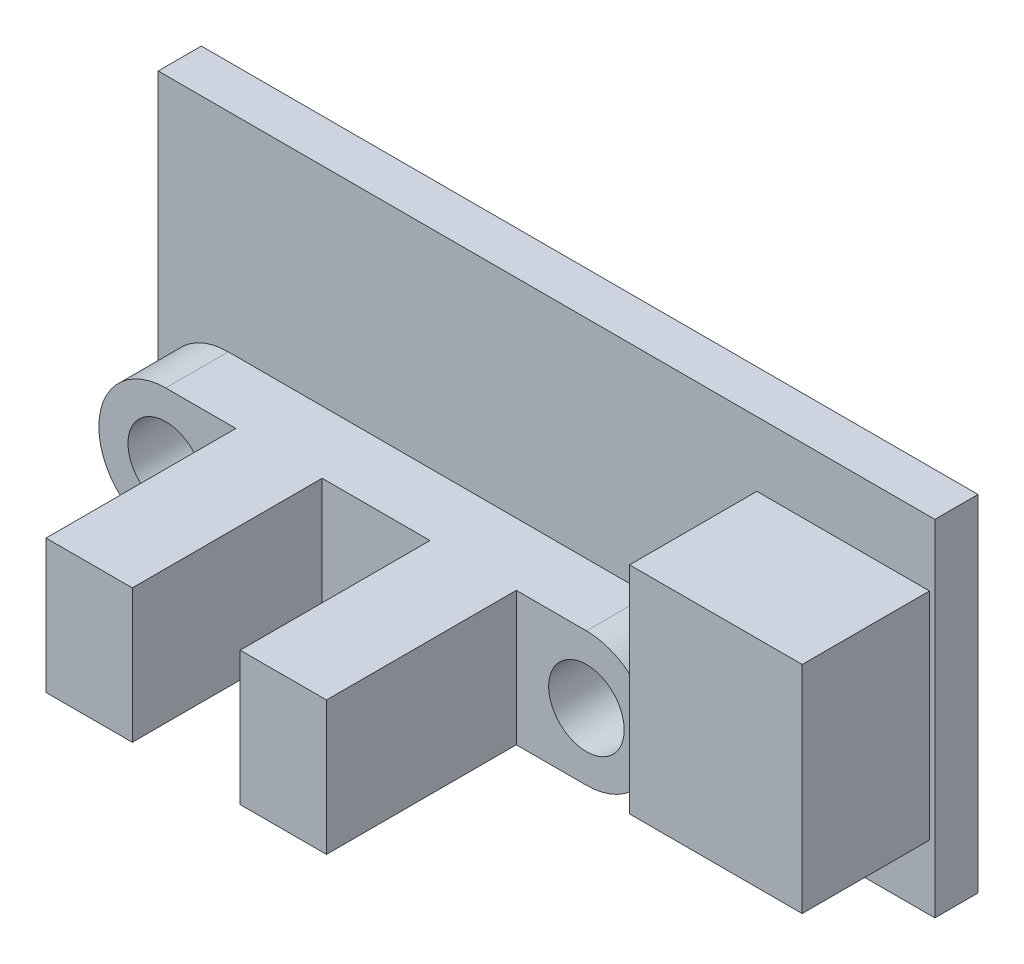
ISO-10303-21;
HEADER;
FILE_DESCRIPTION(('STEP AP214'),'2;1');
FILE_NAME('part.step','',(''),(''),'','','');
FILE_SCHEMA(('AUTOMOTIVE_DESIGN { 1 0 10303 214 1 1 1 1 }'));
ENDSEC;
DATA;
#1=APPLICATION_CONTEXT('core data for automotive mechanical design processes');
#2=APPLICATION_PROTOCOL_DEFINITION('international standard','automotive_design',2000,#1);
#3=PRODUCT_CONTEXT('',#1,'mechanical');
#4=PRODUCT('Part','Part','',(#3));
#5=PRODUCT_RELATED_PRODUCT_CATEGORY('part','',(#4));
#6=PRODUCT_DEFINITION_FORMATION('','',#4);
#7=PRODUCT_DEFINITION_CONTEXT('part definition',#1,'design');
#8=PRODUCT_DEFINITION('design','',#6,#7);
#9=PRODUCT_DEFINITION_SHAPE('','',#8);
#10=(LENGTH_UNIT() NAMED_UNIT(*) SI_UNIT(.MILLI.,.METRE.));
#11=(NAMED_UNIT(*) PLANE_ANGLE_UNIT() SI_UNIT($,.RADIAN.));
#12=(NAMED_UNIT(*) SI_UNIT($,.STERADIAN.) SOLID_ANGLE_UNIT());
#13=UNCERTAINTY_MEASURE_WITH_UNIT(LENGTH_MEASURE(1.E-05),#10,'distance_accuracy_value','');
#14=(GEOMETRIC_REPRESENTATION_CONTEXT(3) GLOBAL_UNCERTAINTY_ASSIGNED_CONTEXT((#13)) GLOBAL_UNIT_ASSIGNED_CONTEXT((#10,
#11,#12)) REPRESENTATION_CONTEXT('',''));
#15=CARTESIAN_POINT('',(0.,0.,0.));
#16=DIRECTION('',(0.,0.,1.));
#17=DIRECTION('',(1.,0.,0.));
#18=AXIS2_PLACEMENT_3D('',#15,#16,#17);
#19=CARTESIAN_POINT('',(0.,0.,2.));
#20=DIRECTION('',(0.,0.,1.));
#21=DIRECTION('',(1.,0.,0.));
#22=AXIS2_PLACEMENT_3D('',#19,#20,#21);
#23=PLANE('',#22);
#24=DIRECTION('',(0.,-1.,0.));
#25=VECTOR('',#24,1.);
#26=CARTESIAN_POINT('',(0.,0.,2.));
#27=LINE('',#26,#25);
#28=CARTESIAN_POINT('',(0.,0.,2.));
#29=VERTEX_POINT('',#28);
#30=CARTESIAN_POINT('',(0.,-16.,2.));
#31=VERTEX_POINT('',#30);
#32=EDGE_CURVE('E287',#29,#31,#27,.T.);
#33=ORIENTED_EDGE('',*,*,#32,.T.);
#34=DIRECTION('',(1.,0.,0.));
#35=VECTOR('',#34,1.);
#36=CARTESIAN_POINT('',(0.,-16.,2.));
#37=LINE('',#36,#35);
#38=CARTESIAN_POINT('',(36.,-16.,2.));
#39=VERTEX_POINT('',#38);
#40=EDGE_CURVE('E290',#31,#39,#37,.T.);
#41=ORIENTED_EDGE('',*,*,#40,.T.);
#42=DIRECTION('',(0.,1.,0.));
#43=VECTOR('',#42,1.);
#44=CARTESIAN_POINT('',(36.,0.,2.));
#45=LINE('',#44,#43);
#46=CARTESIAN_POINT('',(36.,0.,2.));
#47=VERTEX_POINT('',#46);
#48=EDGE_CURVE('E293',#39,#47,#45,.T.);
#49=ORIENTED_EDGE('',*,*,#48,.T.);
#50=DIRECTION('',(-1.,0.,0.));
#51=VECTOR('',#50,1.);
#52=CARTESIAN_POINT('',(0.,0.,2.));
#53=LINE('',#52,#51);
#54=EDGE_CURVE('E295',#47,#29,#53,.T.);
#55=ORIENTED_EDGE('',*,*,#54,.T.);
#56=EDGE_LOOP('',(#33,#41,#49,#55));
#57=FACE_BOUND('',#56,.T.);
#58=DIRECTION('',(-1.,0.,0.));
#59=VECTOR('',#58,1.);
#60=CARTESIAN_POINT('',(3.25,-9.65,2.));
#61=LINE('',#60,#59);
#62=CARTESIAN_POINT('',(22.75,-9.65,2.));
#63=VERTEX_POINT('',#62);
#64=CARTESIAN_POINT('',(3.25,-9.65,2.));
#65=VERTEX_POINT('',#64);
#66=EDGE_CURVE('E271',#63,#65,#61,.T.);
#67=ORIENTED_EDGE('',*,*,#66,.F.);
#68=CARTESIAN_POINT('',(22.75,-12.75,2.));
#69=DIRECTION('',(0.,0.,1.));
#70=DIRECTION('',(1.,0.,0.));
#71=AXIS2_PLACEMENT_3D('',#68,#69,#70);
#72=CIRCLE('',#71,3.1);
#73=CARTESIAN_POINT('',(22.75,-15.85,2.));
#74=VERTEX_POINT('',#73);
#75=EDGE_CURVE('E255',#74,#63,#72,.T.);
#76=ORIENTED_EDGE('',*,*,#75,.F.);
#77=DIRECTION('',(1.,0.,0.));
#78=VECTOR('',#77,1.);
#79=CARTESIAN_POINT('',(22.75,-15.85,2.));
#80=LINE('',#79,#78);
#81=CARTESIAN_POINT('',(3.25,-15.85,2.));
#82=VERTEX_POINT('',#81);
#83=EDGE_CURVE('E259',#82,#74,#80,.T.);
#84=ORIENTED_EDGE('',*,*,#83,.F.);
#85=CARTESIAN_POINT('',(3.25,-12.75,2.));
#86=DIRECTION('',(0.,0.,1.));
#87=DIRECTION('',(1.,0.,0.));
#88=AXIS2_PLACEMENT_3D('',#85,#86,#87);
#89=CIRCLE('',#88,3.1);
#90=EDGE_CURVE('E273',#65,#82,#89,.T.);
#91=ORIENTED_EDGE('',*,*,#90,.F.);
#92=EDGE_LOOP('',(#67,#76,#84,#91));
#93=FACE_BOUND('',#92,.T.);
#94=DIRECTION('',(-1.,0.,0.));
#95=VECTOR('',#94,1.);
#96=CARTESIAN_POINT('',(35.75,-3.,2.));
#97=LINE('',#96,#95);
#98=CARTESIAN_POINT('',(35.75,-3.,2.));
#99=VERTEX_POINT('',#98);
#100=CARTESIAN_POINT('',(27.75,-3.,2.));
#101=VERTEX_POINT('',#100);
#102=EDGE_CURVE('E614',#99,#101,#97,.T.);
#103=ORIENTED_EDGE('',*,*,#102,.F.);
#104=DIRECTION('',(0.,1.,0.));
#105=VECTOR('',#104,1.);
#106=CARTESIAN_POINT('',(35.75,-3.,2.));
#107=LINE('',#106,#105);
#108=CARTESIAN_POINT('',(35.75,-13.,2.));
#109=VERTEX_POINT('',#108);
#110=EDGE_CURVE('E196',#109,#99,#107,.T.);
#111=ORIENTED_EDGE('',*,*,#110,.F.);
#112=DIRECTION('',(1.,0.,0.));
#113=VECTOR('',#112,1.);
#114=CARTESIAN_POINT('',(35.75,-13.,2.));
#115=LINE('',#114,#113);
#116=CARTESIAN_POINT('',(27.75,-13.,2.));
#117=VERTEX_POINT('',#116);
#118=EDGE_CURVE('E192',#117,#109,#115,.T.);
#119=ORIENTED_EDGE('',*,*,#118,.F.);
#120=DIRECTION('',(0.,-1.,0.));
#121=VECTOR('',#120,1.);
#122=CARTESIAN_POINT('',(27.75,-3.,2.));
#123=LINE('',#122,#121);
#124=EDGE_CURVE('E616',#101,#117,#123,.T.);
#125=ORIENTED_EDGE('',*,*,#124,.F.);
#126=EDGE_LOOP('',(#103,#111,#119,#125));
#127=FACE_BOUND('',#126,.T.);
#128=ADVANCED_FACE('F36',(#57,#93,#127),#23,.T.);
#129=CARTESIAN_POINT('',(22.75,-12.75,4.9));
#130=DIRECTION('',(0.,0.,1.));
#131=DIRECTION('',(1.,0.,0.));
#132=AXIS2_PLACEMENT_3D('',#129,#130,#131);
#133=PLANE('',#132);
#134=DIRECTION('',(1.,0.,0.));
#135=VECTOR('',#134,1.);
#136=CARTESIAN_POINT('',(22.75,-15.85,4.9));
#137=LINE('',#136,#135);
#138=CARTESIAN_POINT('',(10.5,-15.85,4.9));
#139=VERTEX_POINT('',#138);
#140=CARTESIAN_POINT('',(15.5,-15.85,4.9));
#141=VERTEX_POINT('',#140);
#142=EDGE_CURVE('E268',#139,#141,#137,.T.);
#143=ORIENTED_EDGE('',*,*,#142,.T.);
#144=DIRECTION('',(0.,-1.,0.));
#145=VECTOR('',#144,1.);
#146=CARTESIAN_POINT('',(15.5,-9.65,4.9));
#147=LINE('',#146,#145);
#148=CARTESIAN_POINT('',(15.5,-9.65,4.9));
#149=VERTEX_POINT('',#148);
#150=EDGE_CURVE('E198',#149,#141,#147,.T.);
#151=ORIENTED_EDGE('',*,*,#150,.F.);
#152=DIRECTION('',(-1.,0.,0.));
#153=VECTOR('',#152,1.);
#154=CARTESIAN_POINT('',(3.25,-9.65,4.9));
#155=LINE('',#154,#153);
#156=CARTESIAN_POINT('',(10.5,-9.65,4.9));
#157=VERTEX_POINT('',#156);
#158=EDGE_CURVE('E262',#149,#157,#155,.T.);
#159=ORIENTED_EDGE('',*,*,#158,.T.);
#160=DIRECTION('',(0.,1.,0.));
#161=VECTOR('',#160,1.);
#162=CARTESIAN_POINT('',(10.5,-9.65,4.9));
#163=LINE('',#162,#161);
#164=EDGE_CURVE('E233',#139,#157,#163,.T.);
#165=ORIENTED_EDGE('',*,*,#164,.F.);
#166=EDGE_LOOP('',(#143,#151,#159,#165));
#167=FACE_BOUND('',#166,.T.);
#168=ADVANCED_FACE('F339',(#167),#133,.T.);
#169=CARTESIAN_POINT('',(22.75,-12.75,4.9));
#170=DIRECTION('',(0.,0.,1.));
#171=DIRECTION('',(1.,0.,0.));
#172=AXIS2_PLACEMENT_3D('',#169,#170,#171);
#173=CIRCLE('',#172,1.75);
#174=CARTESIAN_POINT('',(24.5,-12.75,4.9));
#175=VERTEX_POINT('',#174);
#176=EDGE_CURVE('E627',#175,#175,#173,.T.);
#177=ORIENTED_EDGE('',*,*,#176,.F.);
#178=EDGE_LOOP('',(#177));
#179=FACE_BOUND('',#178,.T.);
#180=CARTESIAN_POINT('',(22.75,-9.65,4.9));
#181=VERTEX_POINT('',#180);
#182=CARTESIAN_POINT('',(19.5,-9.65,4.9));
#183=VERTEX_POINT('',#182);
#184=EDGE_CURVE('E59',#181,#183,#155,.T.);
#185=ORIENTED_EDGE('',*,*,#184,.T.);
#186=DIRECTION('',(0.,1.,0.));
#187=VECTOR('',#186,1.);
#188=CARTESIAN_POINT('',(19.5,-9.65,4.9));
#189=LINE('',#188,#187);
#190=CARTESIAN_POINT('',(19.5,-15.85,4.9));
#191=VERTEX_POINT('',#190);
#192=EDGE_CURVE('E201',#191,#183,#189,.T.);
#193=ORIENTED_EDGE('',*,*,#192,.F.);
#194=CARTESIAN_POINT('',(22.75,-15.85,4.9));
#195=VERTEX_POINT('',#194);
#196=EDGE_CURVE('E264',#191,#195,#137,.T.);
#197=ORIENTED_EDGE('',*,*,#196,.T.);
#198=CARTESIAN_POINT('',(22.75,-12.75,4.9));
#199=DIRECTION('',(0.,0.,1.));
#200=DIRECTION('',(1.,0.,0.));
#201=AXIS2_PLACEMENT_3D('',#198,#199,#200);
#202=CIRCLE('',#201,3.1);
#203=EDGE_CURVE('E256',#195,#181,#202,.T.);
#204=ORIENTED_EDGE('',*,*,#203,.T.);
#205=EDGE_LOOP('',(#185,#193,#197,#204));
#206=FACE_BOUND('',#205,.T.);
#207=ADVANCED_FACE('F344',(#179,#206),#133,.T.);
#208=CARTESIAN_POINT('',(3.25,-12.75,4.9));
#209=DIRECTION('',(0.,0.,1.));
#210=DIRECTION('',(1.,0.,0.));
#211=AXIS2_PLACEMENT_3D('',#208,#209,#210);
#212=CIRCLE('',#211,1.75);
#213=CARTESIAN_POINT('',(5.,-12.75,4.9));
#214=VERTEX_POINT('',#213);
#215=EDGE_CURVE('E582',#214,#214,#212,.T.);
#216=ORIENTED_EDGE('',*,*,#215,.F.);
#217=EDGE_LOOP('',(#216));
#218=FACE_BOUND('',#217,.T.);
#219=DIRECTION('',(0.,-1.,0.));
#220=VECTOR('',#219,1.);
#221=CARTESIAN_POINT('',(6.5,-9.65,4.9));
#222=LINE('',#221,#220);
#223=CARTESIAN_POINT('',(6.5,-9.65,4.9));
#224=VERTEX_POINT('',#223);
#225=CARTESIAN_POINT('',(6.5,-15.85,4.9));
#226=VERTEX_POINT('',#225);
#227=EDGE_CURVE('E228',#224,#226,#222,.T.);
#228=ORIENTED_EDGE('',*,*,#227,.F.);
#229=CARTESIAN_POINT('',(3.25,-9.65,4.9));
#230=VERTEX_POINT('',#229);
#231=EDGE_CURVE('E258',#224,#230,#155,.T.);
#232=ORIENTED_EDGE('',*,*,#231,.T.);
#233=CARTESIAN_POINT('',(3.25,-12.75,4.9));
#234=DIRECTION('',(0.,0.,1.));
#235=DIRECTION('',(1.,0.,0.));
#236=AXIS2_PLACEMENT_3D('',#233,#234,#235);
#237=CIRCLE('',#236,3.1);
#238=CARTESIAN_POINT('',(3.25,-15.85,4.9));
#239=VERTEX_POINT('',#238);
#240=EDGE_CURVE('E261',#230,#239,#237,.T.);
#241=ORIENTED_EDGE('',*,*,#240,.T.);
#242=EDGE_CURVE('E265',#239,#226,#137,.T.);
#243=ORIENTED_EDGE('',*,*,#242,.T.);
#244=EDGE_LOOP('',(#228,#232,#241,#243));
#245=FACE_BOUND('',#244,.T.);
#246=ADVANCED_FACE('F337',(#218,#245),#133,.T.);
#247=CARTESIAN_POINT('',(0.,0.,2.));
#248=DIRECTION('',(1.,0.,0.));
#249=DIRECTION('',(0.,0.,-1.));
#250=AXIS2_PLACEMENT_3D('',#247,#248,#249);
#251=PLANE('',#250);
#252=DIRECTION('',(0.,-1.,0.));
#253=VECTOR('',#252,1.);
#254=CARTESIAN_POINT('',(0.,0.,0.));
#255=LINE('',#254,#253);
#256=CARTESIAN_POINT('',(0.,0.,0.));
#257=VERTEX_POINT('',#256);
#258=CARTESIAN_POINT('',(0.,-16.,0.));
#259=VERTEX_POINT('',#258);
#260=EDGE_CURVE('E286',#257,#259,#255,.T.);
#261=ORIENTED_EDGE('',*,*,#260,.T.);
#262=DIRECTION('',(0.,0.,-1.));
#263=VECTOR('',#262,1.);
#264=CARTESIAN_POINT('',(0.,-16.,2.));
#265=LINE('',#264,#263);
#266=EDGE_CURVE('E11',#31,#259,#265,.T.);
#267=ORIENTED_EDGE('',*,*,#266,.F.);
#268=ORIENTED_EDGE('',*,*,#32,.F.);
#269=DIRECTION('',(0.,0.,-1.));
#270=VECTOR('',#269,1.);
#271=CARTESIAN_POINT('',(0.,0.,2.));
#272=LINE('',#271,#270);
#273=EDGE_CURVE('E297',#29,#257,#272,.T.);
#274=ORIENTED_EDGE('',*,*,#273,.T.);
#275=EDGE_LOOP('',(#261,#267,#268,#274));
#276=FACE_BOUND('',#275,.T.);
#277=ADVANCED_FACE('F38',(#276),#251,.F.);
#278=CARTESIAN_POINT('',(0.,-16.,2.));
#279=DIRECTION('',(0.,1.,0.));
#280=DIRECTION('',(0.,0.,1.));
#281=AXIS2_PLACEMENT_3D('',#278,#279,#280);
#282=PLANE('',#281);
#283=DIRECTION('',(1.,0.,0.));
#284=VECTOR('',#283,1.);
#285=CARTESIAN_POINT('',(0.,-16.,0.));
#286=LINE('',#285,#284);
#287=CARTESIAN_POINT('',(36.,-16.,0.));
#288=VERTEX_POINT('',#287);
#289=EDGE_CURVE('E300',#259,#288,#286,.T.);
#290=ORIENTED_EDGE('',*,*,#289,.T.);
#291=DIRECTION('',(0.,0.,-1.));
#292=VECTOR('',#291,1.);
#293=CARTESIAN_POINT('',(36.,-16.,2.));
#294=LINE('',#293,#292);
#295=EDGE_CURVE('E44',#39,#288,#294,.T.);
#296=ORIENTED_EDGE('',*,*,#295,.F.);
#297=ORIENTED_EDGE('',*,*,#40,.F.);
#298=ORIENTED_EDGE('',*,*,#266,.T.);
#299=EDGE_LOOP('',(#290,#296,#297,#298));
#300=FACE_BOUND('',#299,.T.);
#301=ADVANCED_FACE('F330',(#300),#282,.F.);
#302=CARTESIAN_POINT('',(36.,0.,2.));
#303=DIRECTION('',(-1.,0.,0.));
#304=DIRECTION('',(0.,0.,1.));
#305=AXIS2_PLACEMENT_3D('',#302,#303,#304);
#306=PLANE('',#305);
#307=DIRECTION('',(0.,1.,0.));
#308=VECTOR('',#307,1.);
#309=CARTESIAN_POINT('',(36.,0.,0.));
#310=LINE('',#309,#308);
#311=CARTESIAN_POINT('',(36.,0.,0.));
#312=VERTEX_POINT('',#311);
#313=EDGE_CURVE('E302',#288,#312,#310,.T.);
#314=ORIENTED_EDGE('',*,*,#313,.T.);
#315=DIRECTION('',(0.,0.,-1.));
#316=VECTOR('',#315,1.);
#317=CARTESIAN_POINT('',(36.,0.,2.));
#318=LINE('',#317,#316);
#319=EDGE_CURVE('E307',#47,#312,#318,.T.);
#320=ORIENTED_EDGE('',*,*,#319,.F.);
#321=ORIENTED_EDGE('',*,*,#48,.F.);
#322=ORIENTED_EDGE('',*,*,#295,.T.);
#323=EDGE_LOOP('',(#314,#320,#321,#322));
#324=FACE_BOUND('',#323,.T.);
#325=ADVANCED_FACE('F314',(#324),#306,.F.);
#326=CARTESIAN_POINT('',(0.,0.,2.));
#327=DIRECTION('',(0.,-1.,0.));
#328=DIRECTION('',(0.,0.,-1.));
#329=AXIS2_PLACEMENT_3D('',#326,#327,#328);
#330=PLANE('',#329);
#331=DIRECTION('',(-1.,0.,0.));
#332=VECTOR('',#331,1.);
#333=CARTESIAN_POINT('',(0.,0.,0.));
#334=LINE('',#333,#332);
#335=EDGE_CURVE('E291',#312,#257,#334,.T.);
#336=ORIENTED_EDGE('',*,*,#335,.T.);
#337=ORIENTED_EDGE('',*,*,#273,.F.);
#338=ORIENTED_EDGE('',*,*,#54,.F.);
#339=ORIENTED_EDGE('',*,*,#319,.T.);
#340=EDGE_LOOP('',(#336,#337,#338,#339));
#341=FACE_BOUND('',#340,.T.);
#342=ADVANCED_FACE('F323',(#341),#330,.F.);
#343=CARTESIAN_POINT('',(0.,0.,0.));
#344=DIRECTION('',(0.,0.,1.));
#345=DIRECTION('',(1.,0.,0.));
#346=AXIS2_PLACEMENT_3D('',#343,#344,#345);
#347=PLANE('',#346);
#348=CARTESIAN_POINT('',(3.25,-12.75,0.));
#349=DIRECTION('',(0.,0.,1.));
#350=DIRECTION('',(1.,0.,0.));
#351=AXIS2_PLACEMENT_3D('',#348,#349,#350);
#352=CIRCLE('',#351,1.75);
#353=CARTESIAN_POINT('',(5.,-12.75,0.));
#354=VERTEX_POINT('',#353);
#355=EDGE_CURVE('E619',#354,#354,#352,.T.);
#356=ORIENTED_EDGE('',*,*,#355,.T.);
#357=EDGE_LOOP('',(#356));
#358=FACE_BOUND('',#357,.T.);
#359=CARTESIAN_POINT('',(22.75,-12.75,0.));
#360=DIRECTION('',(0.,0.,1.));
#361=DIRECTION('',(1.,0.,0.));
#362=AXIS2_PLACEMENT_3D('',#359,#360,#361);
#363=CIRCLE('',#362,1.75);
#364=CARTESIAN_POINT('',(24.5,-12.75,0.));
#365=VERTEX_POINT('',#364);
#366=EDGE_CURVE('E630',#365,#365,#363,.T.);
#367=ORIENTED_EDGE('',*,*,#366,.T.);
#368=EDGE_LOOP('',(#367));
#369=FACE_BOUND('',#368,.T.);
#370=ORIENTED_EDGE('',*,*,#260,.F.);
#371=ORIENTED_EDGE('',*,*,#335,.F.);
#372=ORIENTED_EDGE('',*,*,#313,.F.);
#373=ORIENTED_EDGE('',*,*,#289,.F.);
#374=EDGE_LOOP('',(#370,#371,#372,#373));
#375=FACE_BOUND('',#374,.T.);
#376=ADVANCED_FACE('F320',(#358,#369,#375),#347,.F.);
#377=CARTESIAN_POINT('',(22.75,-12.75,4.9));
#378=DIRECTION('',(0.,0.,-1.));
#379=DIRECTION('',(-1.,0.,0.));
#380=AXIS2_PLACEMENT_3D('',#377,#378,#379);
#381=CYLINDRICAL_SURFACE('',#380,3.1);
#382=ORIENTED_EDGE('',*,*,#75,.T.);
#383=DIRECTION('',(0.,0.,-1.));
#384=VECTOR('',#383,1.);
#385=CARTESIAN_POINT('',(22.75,-9.65,4.9));
#386=LINE('',#385,#384);
#387=EDGE_CURVE('E284',#181,#63,#386,.T.);
#388=ORIENTED_EDGE('',*,*,#387,.F.);
#389=ORIENTED_EDGE('',*,*,#203,.F.);
#390=DIRECTION('',(0.,0.,-1.));
#391=VECTOR('',#390,1.);
#392=CARTESIAN_POINT('',(22.75,-15.85,4.9));
#393=LINE('',#392,#391);
#394=EDGE_CURVE('E267',#195,#74,#393,.T.);
#395=ORIENTED_EDGE('',*,*,#394,.T.);
#396=EDGE_LOOP('',(#382,#388,#389,#395));
#397=FACE_BOUND('',#396,.T.);
#398=ADVANCED_FACE('F349',(#397),#381,.T.);
#399=CARTESIAN_POINT('',(3.25,-9.65,4.9));
#400=DIRECTION('',(0.,-1.,0.));
#401=DIRECTION('',(1.,0.,0.));
#402=AXIS2_PLACEMENT_3D('',#399,#400,#401);
#403=PLANE('',#402);
#404=ORIENTED_EDGE('',*,*,#66,.T.);
#405=DIRECTION('',(0.,0.,-1.));
#406=VECTOR('',#405,1.);
#407=CARTESIAN_POINT('',(3.25,-9.65,4.9));
#408=LINE('',#407,#406);
#409=EDGE_CURVE('E281',#230,#65,#408,.T.);
#410=ORIENTED_EDGE('',*,*,#409,.F.);
#411=ORIENTED_EDGE('',*,*,#231,.F.);
#412=DIRECTION('',(0.,0.,-1.));
#413=VECTOR('',#412,1.);
#414=CARTESIAN_POINT('',(6.5,-9.65,13.7));
#415=LINE('',#414,#413);
#416=CARTESIAN_POINT('',(6.5,-9.65,13.7));
#417=VERTEX_POINT('',#416);
#418=EDGE_CURVE('E239',#417,#224,#415,.T.);
#419=ORIENTED_EDGE('',*,*,#418,.F.);
#420=DIRECTION('',(-1.,0.,0.));
#421=VECTOR('',#420,1.);
#422=CARTESIAN_POINT('',(6.5,-9.65,13.7));
#423=LINE('',#422,#421);
#424=CARTESIAN_POINT('',(10.5,-9.65,13.7));
#425=VERTEX_POINT('',#424);
#426=EDGE_CURVE('E237',#425,#417,#423,.T.);
#427=ORIENTED_EDGE('',*,*,#426,.F.);
#428=DIRECTION('',(0.,0.,-1.));
#429=VECTOR('',#428,1.);
#430=CARTESIAN_POINT('',(10.5,-9.65,13.7));
#431=LINE('',#430,#429);
#432=EDGE_CURVE('E246',#425,#157,#431,.T.);
#433=ORIENTED_EDGE('',*,*,#432,.T.);
#434=ORIENTED_EDGE('',*,*,#158,.F.);
#435=DIRECTION('',(0.,0.,-1.));
#436=VECTOR('',#435,1.);
#437=CARTESIAN_POINT('',(15.5,-9.65,13.7));
#438=LINE('',#437,#436);
#439=CARTESIAN_POINT('',(15.5,-9.65,13.7));
#440=VERTEX_POINT('',#439);
#441=EDGE_CURVE('E214',#440,#149,#438,.T.);
#442=ORIENTED_EDGE('',*,*,#441,.F.);
#443=DIRECTION('',(-1.,0.,0.));
#444=VECTOR('',#443,1.);
#445=CARTESIAN_POINT('',(15.5,-9.65,13.7));
#446=LINE('',#445,#444);
#447=CARTESIAN_POINT('',(19.5,-9.65,13.7));
#448=VERTEX_POINT('',#447);
#449=EDGE_CURVE('E213',#448,#440,#446,.T.);
#450=ORIENTED_EDGE('',*,*,#449,.F.);
#451=DIRECTION('',(0.,0.,-1.));
#452=VECTOR('',#451,1.);
#453=CARTESIAN_POINT('',(19.5,-9.65,13.7));
#454=LINE('',#453,#452);
#455=EDGE_CURVE('E219',#448,#183,#454,.T.);
#456=ORIENTED_EDGE('',*,*,#455,.T.);
#457=ORIENTED_EDGE('',*,*,#184,.F.);
#458=ORIENTED_EDGE('',*,*,#387,.T.);
#459=EDGE_LOOP('',(#404,#410,#411,#419,#427,#433,#434,#442,#450,#456,#457,#458));
#460=FACE_BOUND('',#459,.T.);
#461=ADVANCED_FACE('F371',(#460),#403,.F.);
#462=CARTESIAN_POINT('',(3.25,-12.75,4.9));
#463=DIRECTION('',(0.,0.,-1.));
#464=DIRECTION('',(-1.,0.,0.));
#465=AXIS2_PLACEMENT_3D('',#462,#463,#464);
#466=CYLINDRICAL_SURFACE('',#465,3.1);
#467=ORIENTED_EDGE('',*,*,#90,.T.);
#468=DIRECTION('',(0.,0.,-1.));
#469=VECTOR('',#468,1.);
#470=CARTESIAN_POINT('',(3.25,-15.85,4.9));
#471=LINE('',#470,#469);
#472=EDGE_CURVE('E279',#239,#82,#471,.T.);
#473=ORIENTED_EDGE('',*,*,#472,.F.);
#474=ORIENTED_EDGE('',*,*,#240,.F.);
#475=ORIENTED_EDGE('',*,*,#409,.T.);
#476=EDGE_LOOP('',(#467,#473,#474,#475));
#477=FACE_BOUND('',#476,.T.);
#478=ADVANCED_FACE('F379',(#477),#466,.T.);
#479=CARTESIAN_POINT('',(22.75,-15.85,4.9));
#480=DIRECTION('',(0.,1.,0.));
#481=DIRECTION('',(0.,0.,1.));
#482=AXIS2_PLACEMENT_3D('',#479,#480,#481);
#483=PLANE('',#482);
#484=ORIENTED_EDGE('',*,*,#83,.T.);
#485=ORIENTED_EDGE('',*,*,#394,.F.);
#486=ORIENTED_EDGE('',*,*,#196,.F.);
#487=DIRECTION('',(0.,0.,-1.));
#488=VECTOR('',#487,1.);
#489=CARTESIAN_POINT('',(19.5,-15.85,13.7));
#490=LINE('',#489,#488);
#491=CARTESIAN_POINT('',(19.5,-15.85,13.7));
#492=VERTEX_POINT('',#491);
#493=EDGE_CURVE('E222',#492,#191,#490,.T.);
#494=ORIENTED_EDGE('',*,*,#493,.F.);
#495=DIRECTION('',(1.,0.,0.));
#496=VECTOR('',#495,1.);
#497=CARTESIAN_POINT('',(15.5,-15.85,13.7));
#498=LINE('',#497,#496);
#499=CARTESIAN_POINT('',(15.5,-15.85,13.7));
#500=VERTEX_POINT('',#499);
#501=EDGE_CURVE('E209',#500,#492,#498,.T.);
#502=ORIENTED_EDGE('',*,*,#501,.F.);
#503=DIRECTION('',(0.,0.,-1.));
#504=VECTOR('',#503,1.);
#505=CARTESIAN_POINT('',(15.5,-15.85,13.7));
#506=LINE('',#505,#504);
#507=EDGE_CURVE('E225',#500,#141,#506,.T.);
#508=ORIENTED_EDGE('',*,*,#507,.T.);
#509=ORIENTED_EDGE('',*,*,#142,.F.);
#510=DIRECTION('',(0.,0.,-1.));
#511=VECTOR('',#510,1.);
#512=CARTESIAN_POINT('',(10.5,-15.85,13.7));
#513=LINE('',#512,#511);
#514=CARTESIAN_POINT('',(10.5,-15.85,13.7));
#515=VERTEX_POINT('',#514);
#516=EDGE_CURVE('E249',#515,#139,#513,.T.);
#517=ORIENTED_EDGE('',*,*,#516,.F.);
#518=DIRECTION('',(1.,0.,0.));
#519=VECTOR('',#518,1.);
#520=CARTESIAN_POINT('',(6.5,-15.85,13.7));
#521=LINE('',#520,#519);
#522=CARTESIAN_POINT('',(6.5,-15.85,13.7));
#523=VERTEX_POINT('',#522);
#524=EDGE_CURVE('E232',#523,#515,#521,.T.);
#525=ORIENTED_EDGE('',*,*,#524,.F.);
#526=DIRECTION('',(0.,0.,-1.));
#527=VECTOR('',#526,1.);
#528=CARTESIAN_POINT('',(6.5,-15.85,13.7));
#529=LINE('',#528,#527);
#530=EDGE_CURVE('E252',#523,#226,#529,.T.);
#531=ORIENTED_EDGE('',*,*,#530,.T.);
#532=ORIENTED_EDGE('',*,*,#242,.F.);
#533=ORIENTED_EDGE('',*,*,#472,.T.);
#534=EDGE_LOOP('',(#484,#485,#486,#494,#502,#508,#509,#517,#525,#531,#532,#533));
#535=FACE_BOUND('',#534,.T.);
#536=ADVANCED_FACE('F387',(#535),#483,.F.);
#537=CARTESIAN_POINT('',(6.5,-9.65,13.7));
#538=DIRECTION('',(1.,0.,0.));
#539=DIRECTION('',(0.,1.,0.));
#540=AXIS2_PLACEMENT_3D('',#537,#538,#539);
#541=PLANE('',#540);
#542=ORIENTED_EDGE('',*,*,#227,.T.);
#543=ORIENTED_EDGE('',*,*,#530,.F.);
#544=DIRECTION('',(0.,-1.,0.));
#545=VECTOR('',#544,1.);
#546=CARTESIAN_POINT('',(6.5,-9.65,13.7));
#547=LINE('',#546,#545);
#548=EDGE_CURVE('E229',#417,#523,#547,.T.);
#549=ORIENTED_EDGE('',*,*,#548,.F.);
#550=ORIENTED_EDGE('',*,*,#418,.T.);
#551=EDGE_LOOP('',(#542,#543,#549,#550));
#552=FACE_BOUND('',#551,.T.);
#553=ADVANCED_FACE('F394',(#552),#541,.F.);
#554=CARTESIAN_POINT('',(10.5,-9.65,13.7));
#555=DIRECTION('',(-1.,0.,0.));
#556=DIRECTION('',(0.,0.,1.));
#557=AXIS2_PLACEMENT_3D('',#554,#555,#556);
#558=PLANE('',#557);
#559=ORIENTED_EDGE('',*,*,#164,.T.);
#560=ORIENTED_EDGE('',*,*,#432,.F.);
#561=DIRECTION('',(0.,1.,0.));
#562=VECTOR('',#561,1.);
#563=CARTESIAN_POINT('',(10.5,-9.65,13.7));
#564=LINE('',#563,#562);
#565=EDGE_CURVE('E235',#515,#425,#564,.T.);
#566=ORIENTED_EDGE('',*,*,#565,.F.);
#567=ORIENTED_EDGE('',*,*,#516,.T.);
#568=EDGE_LOOP('',(#559,#560,#566,#567));
#569=FACE_BOUND('',#568,.T.);
#570=ADVANCED_FACE('F402',(#569),#558,.F.);
#571=CARTESIAN_POINT('',(0.,0.,13.7));
#572=DIRECTION('',(0.,0.,1.));
#573=DIRECTION('',(1.,0.,0.));
#574=AXIS2_PLACEMENT_3D('',#571,#572,#573);
#575=PLANE('',#574);
#576=ORIENTED_EDGE('',*,*,#548,.T.);
#577=ORIENTED_EDGE('',*,*,#524,.T.);
#578=ORIENTED_EDGE('',*,*,#565,.T.);
#579=ORIENTED_EDGE('',*,*,#426,.T.);
#580=EDGE_LOOP('',(#576,#577,#578,#579));
#581=FACE_BOUND('',#580,.T.);
#582=ADVANCED_FACE('F410',(#581),#575,.T.);
#583=CARTESIAN_POINT('',(15.5,-9.65,13.7));
#584=DIRECTION('',(1.,0.,0.));
#585=DIRECTION('',(0.,0.,-1.));
#586=AXIS2_PLACEMENT_3D('',#583,#584,#585);
#587=PLANE('',#586);
#588=ORIENTED_EDGE('',*,*,#150,.T.);
#589=ORIENTED_EDGE('',*,*,#507,.F.);
#590=DIRECTION('',(0.,-1.,0.));
#591=VECTOR('',#590,1.);
#592=CARTESIAN_POINT('',(15.5,-9.65,13.7));
#593=LINE('',#592,#591);
#594=EDGE_CURVE('E206',#440,#500,#593,.T.);
#595=ORIENTED_EDGE('',*,*,#594,.F.);
#596=ORIENTED_EDGE('',*,*,#441,.T.);
#597=EDGE_LOOP('',(#588,#589,#595,#596));
#598=FACE_BOUND('',#597,.T.);
#599=ADVANCED_FACE('F418',(#598),#587,.F.);
#600=CARTESIAN_POINT('',(19.5,-9.65,13.7));
#601=DIRECTION('',(-1.,0.,0.));
#602=DIRECTION('',(0.,0.,1.));
#603=AXIS2_PLACEMENT_3D('',#600,#601,#602);
#604=PLANE('',#603);
#605=ORIENTED_EDGE('',*,*,#192,.T.);
#606=ORIENTED_EDGE('',*,*,#455,.F.);
#607=DIRECTION('',(0.,1.,0.));
#608=VECTOR('',#607,1.);
#609=CARTESIAN_POINT('',(19.5,-9.65,13.7));
#610=LINE('',#609,#608);
#611=EDGE_CURVE('E211',#492,#448,#610,.T.);
#612=ORIENTED_EDGE('',*,*,#611,.F.);
#613=ORIENTED_EDGE('',*,*,#493,.T.);
#614=EDGE_LOOP('',(#605,#606,#612,#613));
#615=FACE_BOUND('',#614,.T.);
#616=ADVANCED_FACE('F426',(#615),#604,.F.);
#617=CARTESIAN_POINT('',(0.,0.,13.7));
#618=DIRECTION('',(0.,0.,1.));
#619=DIRECTION('',(1.,0.,0.));
#620=AXIS2_PLACEMENT_3D('',#617,#618,#619);
#621=PLANE('',#620);
#622=ORIENTED_EDGE('',*,*,#594,.T.);
#623=ORIENTED_EDGE('',*,*,#501,.T.);
#624=ORIENTED_EDGE('',*,*,#611,.T.);
#625=ORIENTED_EDGE('',*,*,#449,.T.);
#626=EDGE_LOOP('',(#622,#623,#624,#625));
#627=FACE_BOUND('',#626,.T.);
#628=ADVANCED_FACE('F434',(#627),#621,.T.);
#629=CARTESIAN_POINT('',(35.75,-3.,7.9));
#630=DIRECTION('',(-1.,0.,0.));
#631=DIRECTION('',(0.,0.,1.));
#632=AXIS2_PLACEMENT_3D('',#629,#630,#631);
#633=PLANE('',#632);
#634=ORIENTED_EDGE('',*,*,#110,.T.);
#635=DIRECTION('',(0.,0.,-1.));
#636=VECTOR('',#635,1.);
#637=CARTESIAN_POINT('',(35.75,-3.,7.9));
#638=LINE('',#637,#636);
#639=CARTESIAN_POINT('',(35.75,-3.,7.9));
#640=VERTEX_POINT('',#639);
#641=EDGE_CURVE('E177',#640,#99,#638,.T.);
#642=ORIENTED_EDGE('',*,*,#641,.F.);
#643=DIRECTION('',(0.,1.,0.));
#644=VECTOR('',#643,1.);
#645=CARTESIAN_POINT('',(35.75,-3.,7.9));
#646=LINE('',#645,#644);
#647=CARTESIAN_POINT('',(35.75,-13.,7.9));
#648=VERTEX_POINT('',#647);
#649=EDGE_CURVE('E184',#648,#640,#646,.T.);
#650=ORIENTED_EDGE('',*,*,#649,.F.);
#651=DIRECTION('',(0.,0.,-1.));
#652=VECTOR('',#651,1.);
#653=CARTESIAN_POINT('',(35.75,-13.,7.9));
#654=LINE('',#653,#652);
#655=EDGE_CURVE('E624',#648,#109,#654,.T.);
#656=ORIENTED_EDGE('',*,*,#655,.T.);
#657=EDGE_LOOP('',(#634,#642,#650,#656));
#658=FACE_BOUND('',#657,.T.);
#659=ADVANCED_FACE('F194',(#658),#633,.F.);
#660=CARTESIAN_POINT('',(35.75,-3.,7.9));
#661=DIRECTION('',(0.,-1.,0.));
#662=DIRECTION('',(1.,0.,0.));
#663=AXIS2_PLACEMENT_3D('',#660,#661,#662);
#664=PLANE('',#663);
#665=ORIENTED_EDGE('',*,*,#102,.T.);
#666=DIRECTION('',(0.,0.,-1.));
#667=VECTOR('',#666,1.);
#668=CARTESIAN_POINT('',(27.75,-3.,7.9));
#669=LINE('',#668,#667);
#670=CARTESIAN_POINT('',(27.75,-3.,7.9));
#671=VERTEX_POINT('',#670);
#672=EDGE_CURVE('E180',#671,#101,#669,.T.);
#673=ORIENTED_EDGE('',*,*,#672,.F.);
#674=DIRECTION('',(-1.,0.,0.));
#675=VECTOR('',#674,1.);
#676=CARTESIAN_POINT('',(35.75,-3.,7.9));
#677=LINE('',#676,#675);
#678=EDGE_CURVE('E173',#640,#671,#677,.T.);
#679=ORIENTED_EDGE('',*,*,#678,.F.);
#680=ORIENTED_EDGE('',*,*,#641,.T.);
#681=EDGE_LOOP('',(#665,#673,#679,#680));
#682=FACE_BOUND('',#681,.T.);
#683=ADVANCED_FACE('F175',(#682),#664,.F.);
#684=CARTESIAN_POINT('',(27.75,-3.,7.9));
#685=DIRECTION('',(1.,0.,0.));
#686=DIRECTION('',(0.,0.,-1.));
#687=AXIS2_PLACEMENT_3D('',#684,#685,#686);
#688=PLANE('',#687);
#689=ORIENTED_EDGE('',*,*,#124,.T.);
#690=DIRECTION('',(0.,0.,-1.));
#691=VECTOR('',#690,1.);
#692=CARTESIAN_POINT('',(27.75,-13.,7.9));
#693=LINE('',#692,#691);
#694=CARTESIAN_POINT('',(27.75,-13.,7.9));
#695=VERTEX_POINT('',#694);
#696=EDGE_CURVE('E51',#695,#117,#693,.T.);
#697=ORIENTED_EDGE('',*,*,#696,.F.);
#698=DIRECTION('',(0.,-1.,0.));
#699=VECTOR('',#698,1.);
#700=CARTESIAN_POINT('',(27.75,-3.,7.9));
#701=LINE('',#700,#699);
#702=EDGE_CURVE('E183',#671,#695,#701,.T.);
#703=ORIENTED_EDGE('',*,*,#702,.F.);
#704=ORIENTED_EDGE('',*,*,#672,.T.);
#705=EDGE_LOOP('',(#689,#697,#703,#704));
#706=FACE_BOUND('',#705,.T.);
#707=ADVANCED_FACE('F455',(#706),#688,.F.);
#708=CARTESIAN_POINT('',(35.75,-13.,7.9));
#709=DIRECTION('',(0.,1.,0.));
#710=DIRECTION('',(0.,0.,1.));
#711=AXIS2_PLACEMENT_3D('',#708,#709,#710);
#712=PLANE('',#711);
#713=ORIENTED_EDGE('',*,*,#118,.T.);
#714=ORIENTED_EDGE('',*,*,#655,.F.);
#715=DIRECTION('',(1.,0.,0.));
#716=VECTOR('',#715,1.);
#717=CARTESIAN_POINT('',(35.75,-13.,7.9));
#718=LINE('',#717,#716);
#719=EDGE_CURVE('E188',#695,#648,#718,.T.);
#720=ORIENTED_EDGE('',*,*,#719,.F.);
#721=ORIENTED_EDGE('',*,*,#696,.T.);
#722=EDGE_LOOP('',(#713,#714,#720,#721));
#723=FACE_BOUND('',#722,.T.);
#724=ADVANCED_FACE('F462',(#723),#712,.F.);
#725=CARTESIAN_POINT('',(0.,0.,7.9));
#726=DIRECTION('',(0.,0.,-1.));
#727=DIRECTION('',(-1.,0.,0.));
#728=AXIS2_PLACEMENT_3D('',#725,#726,#727);
#729=PLANE('',#728);
#730=ORIENTED_EDGE('',*,*,#649,.T.);
#731=ORIENTED_EDGE('',*,*,#678,.T.);
#732=ORIENTED_EDGE('',*,*,#702,.T.);
#733=ORIENTED_EDGE('',*,*,#719,.T.);
#734=EDGE_LOOP('',(#730,#731,#732,#733));
#735=FACE_BOUND('',#734,.T.);
#736=ADVANCED_FACE('F187',(#735),#729,.F.);
#737=CARTESIAN_POINT('',(22.75,-12.75,0.));
#738=DIRECTION('',(0.,0.,1.));
#739=DIRECTION('',(1.,0.,0.));
#740=AXIS2_PLACEMENT_3D('',#737,#738,#739);
#741=CYLINDRICAL_SURFACE('',#740,1.75);
#742=ORIENTED_EDGE('',*,*,#366,.F.);
#743=EDGE_LOOP('',(#742));
#744=FACE_BOUND('',#743,.T.);
#745=ORIENTED_EDGE('',*,*,#176,.T.);
#746=EDGE_LOOP('',(#745));
#747=FACE_BOUND('',#746,.T.);
#748=ADVANCED_FACE('F476',(#744,#747),#741,.F.);
#749=CARTESIAN_POINT('',(3.25,-12.75,0.));
#750=DIRECTION('',(0.,0.,1.));
#751=DIRECTION('',(1.,0.,0.));
#752=AXIS2_PLACEMENT_3D('',#749,#750,#751);
#753=CYLINDRICAL_SURFACE('',#752,1.75);
#754=ORIENTED_EDGE('',*,*,#355,.F.);
#755=EDGE_LOOP('',(#754));
#756=FACE_BOUND('',#755,.T.);
#757=ORIENTED_EDGE('',*,*,#215,.T.);
#758=EDGE_LOOP('',(#757));
#759=FACE_BOUND('',#758,.T.);
#760=ADVANCED_FACE('F483',(#756,#759),#753,.F.);
#761=CLOSED_SHELL('',(#128,#168,#207,#246,#277,#301,#325,#342,#376,#398,#461,#478,#536,#553,
#570,#582,#599,#616,#628,#659,#683,#707,#724,#736,#748,#760));
#762=MANIFOLD_SOLID_BREP('B2',#761);
#763=ADVANCED_BREP_SHAPE_REPRESENTATION('',(#18,#762),#14);
#764=SHAPE_DEFINITION_REPRESENTATION(#9,#763);
ENDSEC;
END-ISO-10303-21;
